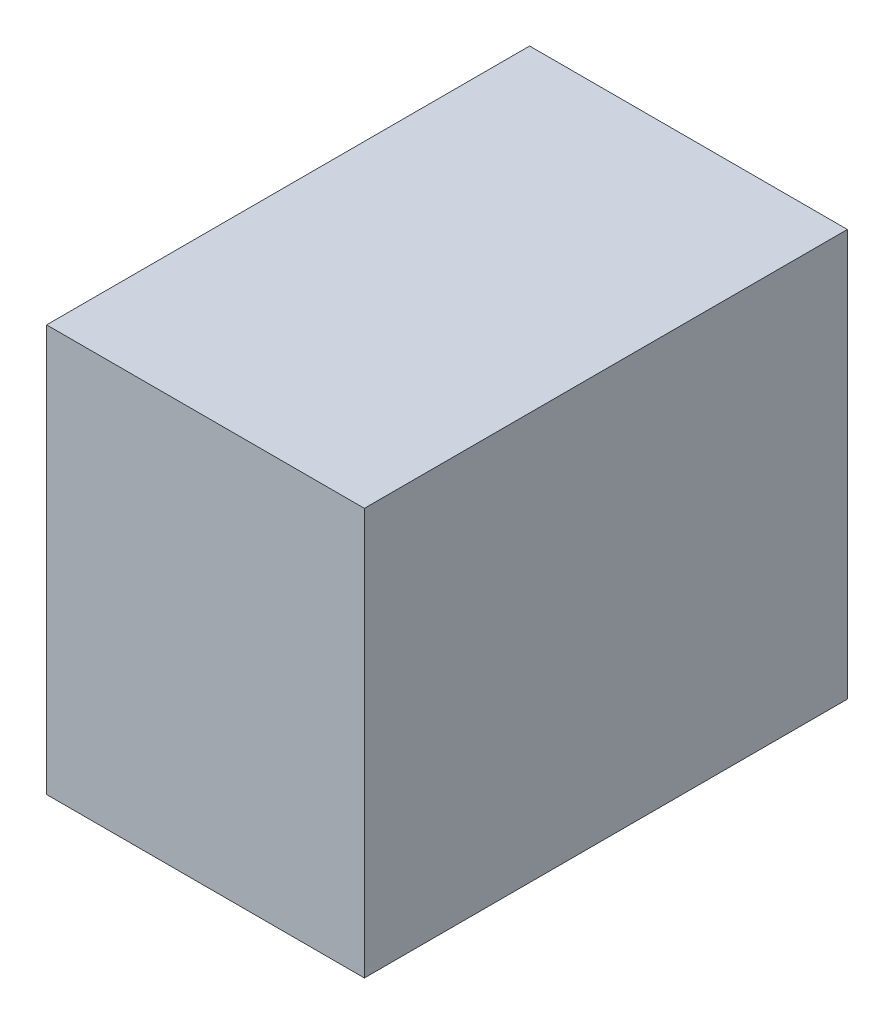
ISO-10303-21;
HEADER;
FILE_DESCRIPTION(('STEP AP214'),'2;1');
FILE_NAME('part.step','',(''),(''),'','','');
FILE_SCHEMA(('AUTOMOTIVE_DESIGN { 1 0 10303 214 1 1 1 1 }'));
ENDSEC;
DATA;
#1=APPLICATION_CONTEXT('core data for automotive mechanical design processes');
#2=APPLICATION_PROTOCOL_DEFINITION('international standard','automotive_design',2000,#1);
#3=PRODUCT_CONTEXT('',#1,'mechanical');
#4=PRODUCT('Part','Part','',(#3));
#5=PRODUCT_RELATED_PRODUCT_CATEGORY('part','',(#4));
#6=PRODUCT_DEFINITION_FORMATION('','',#4);
#7=PRODUCT_DEFINITION_CONTEXT('part definition',#1,'design');
#8=PRODUCT_DEFINITION('design','',#6,#7);
#9=PRODUCT_DEFINITION_SHAPE('','',#8);
#10=(LENGTH_UNIT() NAMED_UNIT(*) SI_UNIT(.MILLI.,.METRE.));
#11=(NAMED_UNIT(*) PLANE_ANGLE_UNIT() SI_UNIT($,.RADIAN.));
#12=(NAMED_UNIT(*) SI_UNIT($,.STERADIAN.) SOLID_ANGLE_UNIT());
#13=UNCERTAINTY_MEASURE_WITH_UNIT(LENGTH_MEASURE(1.E-05),#10,'distance_accuracy_value','');
#14=(GEOMETRIC_REPRESENTATION_CONTEXT(3) GLOBAL_UNCERTAINTY_ASSIGNED_CONTEXT((#13)) GLOBAL_UNIT_ASSIGNED_CONTEXT((#10,
#11,#12)) REPRESENTATION_CONTEXT('',''));
#15=CARTESIAN_POINT('',(0.,0.,0.));
#16=DIRECTION('',(0.,0.,1.));
#17=DIRECTION('',(1.,0.,0.));
#18=AXIS2_PLACEMENT_3D('',#15,#16,#17);
#19=CARTESIAN_POINT('',(2.90000000000011,28.1383297014436,38.));
#20=DIRECTION('',(0.,-1.,0.));
#21=DIRECTION('',(0.,0.,-1.));
#22=AXIS2_PLACEMENT_3D('',#19,#20,#21);
#23=PLANE('',#22);
#24=DIRECTION('',(-1.,0.,0.));
#25=VECTOR('',#24,1.);
#26=CARTESIAN_POINT('',(2.90000000000011,28.1383297014436,0.));
#27=LINE('',#26,#25);
#28=CARTESIAN_POINT('',(27.9000000000001,28.1383297014436,0.));
#29=VERTEX_POINT('',#28);
#30=CARTESIAN_POINT('',(2.90000000000011,28.1383297014436,0.));
#31=VERTEX_POINT('',#30);
#32=EDGE_CURVE('E96',#29,#31,#27,.T.);
#33=ORIENTED_EDGE('',*,*,#32,.T.);
#34=DIRECTION('',(0.,0.,-1.));
#35=VECTOR('',#34,1.);
#36=CARTESIAN_POINT('',(2.90000000000011,28.1383297014436,38.));
#37=LINE('',#36,#35);
#38=CARTESIAN_POINT('',(2.90000000000011,28.1383297014436,38.));
#39=VERTEX_POINT('',#38);
#40=EDGE_CURVE('E11',#39,#31,#37,.T.);
#41=ORIENTED_EDGE('',*,*,#40,.F.);
#42=DIRECTION('',(-1.,0.,0.));
#43=VECTOR('',#42,1.);
#44=CARTESIAN_POINT('',(2.90000000000011,28.1383297014436,38.));
#45=LINE('',#44,#43);
#46=CARTESIAN_POINT('',(27.9000000000001,28.1383297014436,38.));
#47=VERTEX_POINT('',#46);
#48=EDGE_CURVE('E84',#47,#39,#45,.T.);
#49=ORIENTED_EDGE('',*,*,#48,.F.);
#50=DIRECTION('',(0.,0.,-1.));
#51=VECTOR('',#50,1.);
#52=CARTESIAN_POINT('',(27.9000000000001,28.1383297014436,38.));
#53=LINE('',#52,#51);
#54=EDGE_CURVE('E92',#47,#29,#53,.T.);
#55=ORIENTED_EDGE('',*,*,#54,.T.);
#56=EDGE_LOOP('',(#33,#41,#49,#55));
#57=FACE_BOUND('',#56,.T.);
#58=ADVANCED_FACE('F33',(#57),#23,.F.);
#59=CARTESIAN_POINT('',(2.90000000000011,28.1383297014436,38.));
#60=DIRECTION('',(1.,0.,0.));
#61=DIRECTION('',(0.,1.,0.));
#62=AXIS2_PLACEMENT_3D('',#59,#60,#61);
#63=PLANE('',#62);
#64=DIRECTION('',(0.,-1.,0.));
#65=VECTOR('',#64,1.);
#66=CARTESIAN_POINT('',(2.90000000000011,28.1383297014436,0.));
#67=LINE('',#66,#65);
#68=CARTESIAN_POINT('',(2.90000000000012,-3.86167029855643,0.));
#69=VERTEX_POINT('',#68);
#70=EDGE_CURVE('E88',#31,#69,#67,.T.);
#71=ORIENTED_EDGE('',*,*,#70,.T.);
#72=DIRECTION('',(0.,0.,-1.));
#73=VECTOR('',#72,1.);
#74=CARTESIAN_POINT('',(2.90000000000012,-3.86167029855643,38.));
#75=LINE('',#74,#73);
#76=CARTESIAN_POINT('',(2.90000000000012,-3.86167029855643,38.));
#77=VERTEX_POINT('',#76);
#78=EDGE_CURVE('E41',#77,#69,#75,.T.);
#79=ORIENTED_EDGE('',*,*,#78,.F.);
#80=DIRECTION('',(0.,-1.,0.));
#81=VECTOR('',#80,1.);
#82=CARTESIAN_POINT('',(2.90000000000011,28.1383297014436,38.));
#83=LINE('',#82,#81);
#84=EDGE_CURVE('E79',#39,#77,#83,.T.);
#85=ORIENTED_EDGE('',*,*,#84,.F.);
#86=ORIENTED_EDGE('',*,*,#40,.T.);
#87=EDGE_LOOP('',(#71,#79,#85,#86));
#88=FACE_BOUND('',#87,.T.);
#89=ADVANCED_FACE('F87',(#88),#63,.F.);
#90=CARTESIAN_POINT('',(2.90000000000012,-3.86167029855643,38.));
#91=DIRECTION('',(0.,1.,0.));
#92=DIRECTION('',(0.,0.,1.));
#93=AXIS2_PLACEMENT_3D('',#90,#91,#92);
#94=PLANE('',#93);
#95=DIRECTION('',(1.,0.,0.));
#96=VECTOR('',#95,1.);
#97=CARTESIAN_POINT('',(2.90000000000012,-3.86167029855643,0.));
#98=LINE('',#97,#96);
#99=CARTESIAN_POINT('',(27.9000000000001,-3.86167029855643,0.));
#100=VERTEX_POINT('',#99);
#101=EDGE_CURVE('E66',#69,#100,#98,.T.);
#102=ORIENTED_EDGE('',*,*,#101,.T.);
#103=DIRECTION('',(0.,0.,-1.));
#104=VECTOR('',#103,1.);
#105=CARTESIAN_POINT('',(27.9000000000001,-3.86167029855643,38.));
#106=LINE('',#105,#104);
#107=CARTESIAN_POINT('',(27.9000000000001,-3.86167029855643,38.));
#108=VERTEX_POINT('',#107);
#109=EDGE_CURVE('E89',#108,#100,#106,.T.);
#110=ORIENTED_EDGE('',*,*,#109,.F.);
#111=DIRECTION('',(1.,0.,0.));
#112=VECTOR('',#111,1.);
#113=CARTESIAN_POINT('',(2.90000000000012,-3.86167029855643,38.));
#114=LINE('',#113,#112);
#115=EDGE_CURVE('E82',#77,#108,#114,.T.);
#116=ORIENTED_EDGE('',*,*,#115,.F.);
#117=ORIENTED_EDGE('',*,*,#78,.T.);
#118=EDGE_LOOP('',(#102,#110,#116,#117));
#119=FACE_BOUND('',#118,.T.);
#120=ADVANCED_FACE('F90',(#119),#94,.F.);
#121=CARTESIAN_POINT('',(27.9000000000001,-3.86167029855643,38.));
#122=DIRECTION('',(-1.,0.,0.));
#123=DIRECTION('',(0.,0.,1.));
#124=AXIS2_PLACEMENT_3D('',#121,#122,#123);
#125=PLANE('',#124);
#126=DIRECTION('',(0.,1.,0.));
#127=VECTOR('',#126,1.);
#128=CARTESIAN_POINT('',(27.9000000000001,-3.86167029855643,0.));
#129=LINE('',#128,#127);
#130=EDGE_CURVE('E72',#100,#29,#129,.T.);
#131=ORIENTED_EDGE('',*,*,#130,.T.);
#132=ORIENTED_EDGE('',*,*,#54,.F.);
#133=DIRECTION('',(0.,1.,0.));
#134=VECTOR('',#133,1.);
#135=CARTESIAN_POINT('',(27.9000000000001,-3.86167029855643,38.));
#136=LINE('',#135,#134);
#137=EDGE_CURVE('E49',#108,#47,#136,.T.);
#138=ORIENTED_EDGE('',*,*,#137,.F.);
#139=ORIENTED_EDGE('',*,*,#109,.T.);
#140=EDGE_LOOP('',(#131,#132,#138,#139));
#141=FACE_BOUND('',#140,.T.);
#142=ADVANCED_FACE('F103',(#141),#125,.F.);
#143=CARTESIAN_POINT('',(0.,0.,38.));
#144=DIRECTION('',(0.,0.,1.));
#145=DIRECTION('',(1.,0.,0.));
#146=AXIS2_PLACEMENT_3D('',#143,#144,#145);
#147=PLANE('',#146);
#148=ORIENTED_EDGE('',*,*,#48,.T.);
#149=ORIENTED_EDGE('',*,*,#84,.T.);
#150=ORIENTED_EDGE('',*,*,#115,.T.);
#151=ORIENTED_EDGE('',*,*,#137,.T.);
#152=EDGE_LOOP('',(#148,#149,#150,#151));
#153=FACE_BOUND('',#152,.T.);
#154=ADVANCED_FACE('F80',(#153),#147,.T.);
#155=CARTESIAN_POINT('',(0.,0.,0.));
#156=DIRECTION('',(0.,0.,1.));
#157=DIRECTION('',(1.,0.,0.));
#158=AXIS2_PLACEMENT_3D('',#155,#156,#157);
#159=PLANE('',#158);
#160=ORIENTED_EDGE('',*,*,#32,.F.);
#161=ORIENTED_EDGE('',*,*,#130,.F.);
#162=ORIENTED_EDGE('',*,*,#101,.F.);
#163=ORIENTED_EDGE('',*,*,#70,.F.);
#164=EDGE_LOOP('',(#160,#161,#162,#163));
#165=FACE_BOUND('',#164,.T.);
#166=ADVANCED_FACE('F106',(#165),#159,.F.);
#167=CLOSED_SHELL('',(#58,#89,#120,#142,#154,#166));
#168=MANIFOLD_SOLID_BREP('B2',#167);
#169=ADVANCED_BREP_SHAPE_REPRESENTATION('',(#18,#168),#14);
#170=SHAPE_DEFINITION_REPRESENTATION(#9,#169);
ENDSEC;
END-ISO-10303-21;
